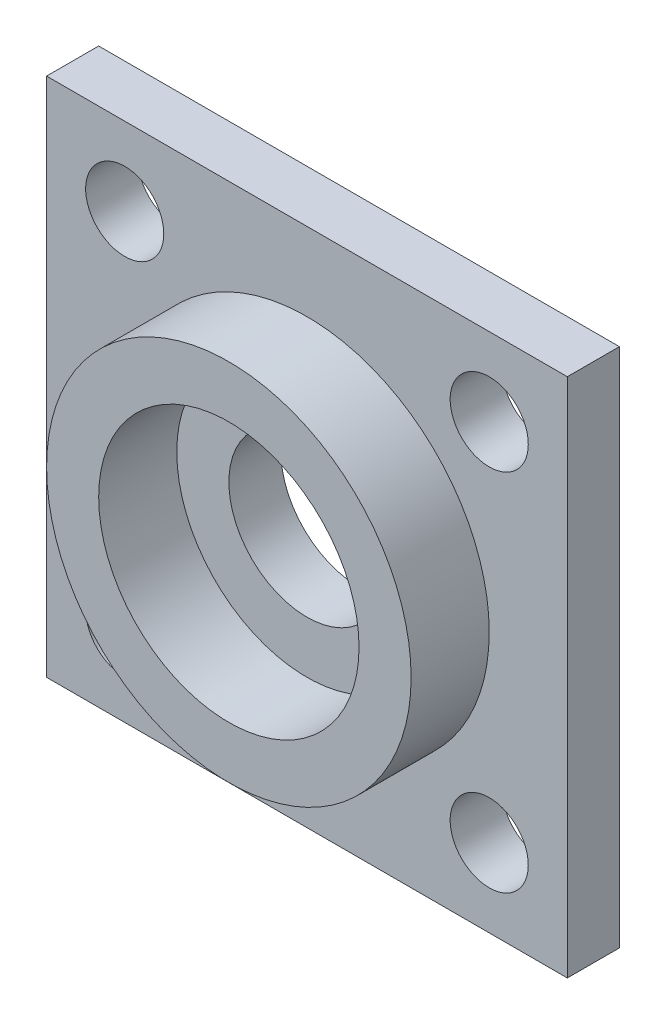
ISO-10303-21;
HEADER;
FILE_DESCRIPTION(('STEP AP214'),'2;1');
FILE_NAME('part.step','',(''),(''),'','','');
FILE_SCHEMA(('AUTOMOTIVE_DESIGN { 1 0 10303 214 1 1 1 1 }'));
ENDSEC;
DATA;
#1=APPLICATION_CONTEXT('core data for automotive mechanical design processes');
#2=APPLICATION_PROTOCOL_DEFINITION('international standard','automotive_design',2000,#1);
#3=PRODUCT_CONTEXT('',#1,'mechanical');
#4=PRODUCT('Part','Part','',(#3));
#5=PRODUCT_RELATED_PRODUCT_CATEGORY('part','',(#4));
#6=PRODUCT_DEFINITION_FORMATION('','',#4);
#7=PRODUCT_DEFINITION_CONTEXT('part definition',#1,'design');
#8=PRODUCT_DEFINITION('design','',#6,#7);
#9=PRODUCT_DEFINITION_SHAPE('','',#8);
#10=(LENGTH_UNIT() NAMED_UNIT(*) SI_UNIT(.MILLI.,.METRE.));
#11=(NAMED_UNIT(*) PLANE_ANGLE_UNIT() SI_UNIT($,.RADIAN.));
#12=(NAMED_UNIT(*) SI_UNIT($,.STERADIAN.) SOLID_ANGLE_UNIT());
#13=UNCERTAINTY_MEASURE_WITH_UNIT(LENGTH_MEASURE(1.E-05),#10,'distance_accuracy_value','');
#14=(GEOMETRIC_REPRESENTATION_CONTEXT(3) GLOBAL_UNCERTAINTY_ASSIGNED_CONTEXT((#13)) GLOBAL_UNIT_ASSIGNED_CONTEXT((#10,
#11,#12)) REPRESENTATION_CONTEXT('',''));
#15=CARTESIAN_POINT('',(0.,0.,0.));
#16=DIRECTION('',(0.,0.,1.));
#17=DIRECTION('',(1.,0.,0.));
#18=AXIS2_PLACEMENT_3D('',#15,#16,#17);
#19=CARTESIAN_POINT('',(0.,0.,2.));
#20=DIRECTION('',(0.,0.,1.));
#21=DIRECTION('',(1.,0.,0.));
#22=AXIS2_PLACEMENT_3D('',#19,#20,#21);
#23=PLANE('',#22);
#24=CARTESIAN_POINT('',(0.,0.,2.));
#25=DIRECTION('',(0.,0.,1.));
#26=DIRECTION('',(1.,0.,0.));
#27=AXIS2_PLACEMENT_3D('',#24,#25,#26);
#28=CIRCLE('',#27,3.);
#29=CARTESIAN_POINT('',(3.,0.,2.));
#30=VERTEX_POINT('',#29);
#31=EDGE_CURVE('E156',#30,#30,#28,.T.);
#32=ORIENTED_EDGE('',*,*,#31,.F.);
#33=EDGE_LOOP('',(#32));
#34=FACE_BOUND('',#33,.T.);
#35=CARTESIAN_POINT('',(0.,0.,2.));
#36=DIRECTION('',(0.,0.,1.));
#37=DIRECTION('',(1.,0.,0.));
#38=AXIS2_PLACEMENT_3D('',#35,#36,#37);
#39=CIRCLE('',#38,5.);
#40=CARTESIAN_POINT('',(5.,0.,2.));
#41=VERTEX_POINT('',#40);
#42=EDGE_CURVE('E11',#41,#41,#39,.F.);
#43=ORIENTED_EDGE('',*,*,#42,.F.);
#44=EDGE_LOOP('',(#43));
#45=FACE_BOUND('',#44,.T.);
#46=ADVANCED_FACE('F35',(#34,#45),#23,.T.);
#47=CARTESIAN_POINT('',(0.,0.,2.));
#48=DIRECTION('',(0.,0.,1.));
#49=DIRECTION('',(1.,0.,0.));
#50=AXIS2_PLACEMENT_3D('',#47,#48,#49);
#51=CIRCLE('',#50,7.);
#52=CARTESIAN_POINT('',(7.,0.,2.));
#53=VERTEX_POINT('',#52);
#54=EDGE_CURVE('E144',#53,#53,#51,.T.);
#55=ORIENTED_EDGE('',*,*,#54,.F.);
#56=EDGE_LOOP('',(#55));
#57=FACE_BOUND('',#56,.T.);
#58=CARTESIAN_POINT('',(7.00000000000039,-6.99999999999961,2.));
#59=DIRECTION('',(0.,0.,1.));
#60=DIRECTION('',(1.,0.,0.));
#61=AXIS2_PLACEMENT_3D('',#58,#59,#60);
#62=CIRCLE('',#61,1.50000000000055);
#63=CARTESIAN_POINT('',(8.50000000000094,-6.99999999999961,2.));
#64=VERTEX_POINT('',#63);
#65=EDGE_CURVE('E148',#64,#64,#62,.T.);
#66=ORIENTED_EDGE('',*,*,#65,.F.);
#67=EDGE_LOOP('',(#66));
#68=FACE_BOUND('',#67,.T.);
#69=DIRECTION('',(0.,1.,0.));
#70=VECTOR('',#69,1.);
#71=CARTESIAN_POINT('',(10.,10.,2.));
#72=LINE('',#71,#70);
#73=CARTESIAN_POINT('',(10.,-10.,2.));
#74=VERTEX_POINT('',#73);
#75=CARTESIAN_POINT('',(10.,10.,2.));
#76=VERTEX_POINT('',#75);
#77=EDGE_CURVE('E89',#74,#76,#72,.T.);
#78=ORIENTED_EDGE('',*,*,#77,.T.);
#79=DIRECTION('',(-1.,0.,0.));
#80=VECTOR('',#79,1.);
#81=CARTESIAN_POINT('',(-10.,10.,2.));
#82=LINE('',#81,#80);
#83=CARTESIAN_POINT('',(-10.,10.,2.));
#84=VERTEX_POINT('',#83);
#85=EDGE_CURVE('E83',#76,#84,#82,.T.);
#86=ORIENTED_EDGE('',*,*,#85,.T.);
#87=DIRECTION('',(0.,-1.,0.));
#88=VECTOR('',#87,1.);
#89=CARTESIAN_POINT('',(-10.,10.,2.));
#90=LINE('',#89,#88);
#91=CARTESIAN_POINT('',(-10.,-10.,2.));
#92=VERTEX_POINT('',#91);
#93=EDGE_CURVE('E87',#84,#92,#90,.T.);
#94=ORIENTED_EDGE('',*,*,#93,.T.);
#95=DIRECTION('',(1.,0.,0.));
#96=VECTOR('',#95,1.);
#97=CARTESIAN_POINT('',(-10.,-10.,2.));
#98=LINE('',#97,#96);
#99=EDGE_CURVE('E52',#92,#74,#98,.T.);
#100=ORIENTED_EDGE('',*,*,#99,.T.);
#101=EDGE_LOOP('',(#78,#86,#94,#100));
#102=FACE_BOUND('',#101,.T.);
#103=CARTESIAN_POINT('',(-7.,7.,2.));
#104=DIRECTION('',(0.,0.,1.));
#105=DIRECTION('',(1.,0.,0.));
#106=AXIS2_PLACEMENT_3D('',#103,#104,#105);
#107=CIRCLE('',#106,1.5);
#108=CARTESIAN_POINT('',(-5.5,7.,2.));
#109=VERTEX_POINT('',#108);
#110=EDGE_CURVE('E106',#109,#109,#107,.T.);
#111=ORIENTED_EDGE('',*,*,#110,.F.);
#112=EDGE_LOOP('',(#111));
#113=FACE_BOUND('',#112,.T.);
#114=CARTESIAN_POINT('',(7.,7.00000000000039,2.));
#115=DIRECTION('',(0.,0.,1.));
#116=DIRECTION('',(1.,0.,0.));
#117=AXIS2_PLACEMENT_3D('',#114,#115,#116);
#118=CIRCLE('',#117,1.5000000000004);
#119=CARTESIAN_POINT('',(8.5000000000004,7.00000000000039,2.));
#120=VERTEX_POINT('',#119);
#121=EDGE_CURVE('E152',#120,#120,#118,.T.);
#122=ORIENTED_EDGE('',*,*,#121,.F.);
#123=EDGE_LOOP('',(#122));
#124=FACE_BOUND('',#123,.T.);
#125=CARTESIAN_POINT('',(-6.99999999999961,-7.,2.));
#126=DIRECTION('',(0.,0.,1.));
#127=DIRECTION('',(1.,0.,0.));
#128=AXIS2_PLACEMENT_3D('',#125,#126,#127);
#129=CIRCLE('',#128,1.50000000000021);
#130=CARTESIAN_POINT('',(-5.4999999999994,-7.,2.));
#131=VERTEX_POINT('',#130);
#132=EDGE_CURVE('E138',#131,#131,#129,.T.);
#133=ORIENTED_EDGE('',*,*,#132,.F.);
#134=EDGE_LOOP('',(#133));
#135=FACE_BOUND('',#134,.T.);
#136=ADVANCED_FACE('F84',(#57,#68,#102,#113,#124,#135),#23,.T.);
#137=CARTESIAN_POINT('',(0.,0.,0.));
#138=DIRECTION('',(0.,0.,1.));
#139=DIRECTION('',(1.,0.,0.));
#140=AXIS2_PLACEMENT_3D('',#137,#138,#139);
#141=PLANE('',#140);
#142=DIRECTION('',(0.,1.,0.));
#143=VECTOR('',#142,1.);
#144=CARTESIAN_POINT('',(10.,10.,0.));
#145=LINE('',#144,#143);
#146=CARTESIAN_POINT('',(10.,-10.,0.));
#147=VERTEX_POINT('',#146);
#148=CARTESIAN_POINT('',(10.,10.,0.));
#149=VERTEX_POINT('',#148);
#150=EDGE_CURVE('E103',#147,#149,#145,.T.);
#151=ORIENTED_EDGE('',*,*,#150,.F.);
#152=DIRECTION('',(1.,0.,0.));
#153=VECTOR('',#152,1.);
#154=CARTESIAN_POINT('',(-10.,-10.,0.));
#155=LINE('',#154,#153);
#156=CARTESIAN_POINT('',(-10.,-10.,0.));
#157=VERTEX_POINT('',#156);
#158=EDGE_CURVE('E75',#157,#147,#155,.T.);
#159=ORIENTED_EDGE('',*,*,#158,.F.);
#160=DIRECTION('',(0.,-1.,0.));
#161=VECTOR('',#160,1.);
#162=CARTESIAN_POINT('',(-10.,10.,0.));
#163=LINE('',#162,#161);
#164=CARTESIAN_POINT('',(-10.,10.,0.));
#165=VERTEX_POINT('',#164);
#166=EDGE_CURVE('E69',#165,#157,#163,.T.);
#167=ORIENTED_EDGE('',*,*,#166,.F.);
#168=DIRECTION('',(-1.,0.,0.));
#169=VECTOR('',#168,1.);
#170=CARTESIAN_POINT('',(-10.,10.,0.));
#171=LINE('',#170,#169);
#172=EDGE_CURVE('E94',#149,#165,#171,.T.);
#173=ORIENTED_EDGE('',*,*,#172,.F.);
#174=EDGE_LOOP('',(#151,#159,#167,#173));
#175=FACE_BOUND('',#174,.T.);
#176=CARTESIAN_POINT('',(-7.,7.,0.));
#177=DIRECTION('',(0.,0.,1.));
#178=DIRECTION('',(1.,0.,0.));
#179=AXIS2_PLACEMENT_3D('',#176,#177,#178);
#180=CIRCLE('',#179,1.5);
#181=CARTESIAN_POINT('',(-5.5,7.,0.));
#182=VERTEX_POINT('',#181);
#183=EDGE_CURVE('E121',#182,#182,#180,.T.);
#184=ORIENTED_EDGE('',*,*,#183,.T.);
#185=EDGE_LOOP('',(#184));
#186=FACE_BOUND('',#185,.T.);
#187=CARTESIAN_POINT('',(0.,0.,0.));
#188=DIRECTION('',(0.,0.,1.));
#189=DIRECTION('',(1.,0.,0.));
#190=AXIS2_PLACEMENT_3D('',#187,#188,#189);
#191=CIRCLE('',#190,3.);
#192=CARTESIAN_POINT('',(3.,0.,0.));
#193=VERTEX_POINT('',#192);
#194=EDGE_CURVE('E125',#193,#193,#191,.T.);
#195=ORIENTED_EDGE('',*,*,#194,.T.);
#196=EDGE_LOOP('',(#195));
#197=FACE_BOUND('',#196,.T.);
#198=CARTESIAN_POINT('',(7.,7.00000000000039,0.));
#199=DIRECTION('',(0.,0.,1.));
#200=DIRECTION('',(1.,0.,0.));
#201=AXIS2_PLACEMENT_3D('',#198,#199,#200);
#202=CIRCLE('',#201,1.5000000000004);
#203=CARTESIAN_POINT('',(8.5000000000004,7.00000000000039,0.));
#204=VERTEX_POINT('',#203);
#205=EDGE_CURVE('E129',#204,#204,#202,.T.);
#206=ORIENTED_EDGE('',*,*,#205,.T.);
#207=EDGE_LOOP('',(#206));
#208=FACE_BOUND('',#207,.T.);
#209=CARTESIAN_POINT('',(7.00000000000039,-6.99999999999961,0.));
#210=DIRECTION('',(0.,0.,1.));
#211=DIRECTION('',(1.,0.,0.));
#212=AXIS2_PLACEMENT_3D('',#209,#210,#211);
#213=CIRCLE('',#212,1.50000000000055);
#214=CARTESIAN_POINT('',(8.50000000000094,-6.99999999999961,0.));
#215=VERTEX_POINT('',#214);
#216=EDGE_CURVE('E133',#215,#215,#213,.T.);
#217=ORIENTED_EDGE('',*,*,#216,.T.);
#218=EDGE_LOOP('',(#217));
#219=FACE_BOUND('',#218,.T.);
#220=CARTESIAN_POINT('',(-6.99999999999961,-7.,0.));
#221=DIRECTION('',(0.,0.,1.));
#222=DIRECTION('',(1.,0.,0.));
#223=AXIS2_PLACEMENT_3D('',#220,#221,#222);
#224=CIRCLE('',#223,1.50000000000021);
#225=CARTESIAN_POINT('',(-5.4999999999994,-7.,0.));
#226=VERTEX_POINT('',#225);
#227=EDGE_CURVE('E136',#226,#226,#224,.T.);
#228=ORIENTED_EDGE('',*,*,#227,.T.);
#229=EDGE_LOOP('',(#228));
#230=FACE_BOUND('',#229,.T.);
#231=ADVANCED_FACE('F114',(#175,#186,#197,#208,#219,#230),#141,.F.);
#232=CARTESIAN_POINT('',(10.,10.,2.));
#233=DIRECTION('',(-1.,0.,0.));
#234=DIRECTION('',(0.,-1.,0.));
#235=AXIS2_PLACEMENT_3D('',#232,#233,#234);
#236=PLANE('',#235);
#237=ORIENTED_EDGE('',*,*,#150,.T.);
#238=DIRECTION('',(0.,0.,-1.));
#239=VECTOR('',#238,1.);
#240=CARTESIAN_POINT('',(10.,10.,2.));
#241=LINE('',#240,#239);
#242=EDGE_CURVE('E44',#76,#149,#241,.T.);
#243=ORIENTED_EDGE('',*,*,#242,.F.);
#244=ORIENTED_EDGE('',*,*,#77,.F.);
#245=DIRECTION('',(0.,0.,-1.));
#246=VECTOR('',#245,1.);
#247=CARTESIAN_POINT('',(10.,-10.,2.));
#248=LINE('',#247,#246);
#249=EDGE_CURVE('E99',#74,#147,#248,.T.);
#250=ORIENTED_EDGE('',*,*,#249,.T.);
#251=EDGE_LOOP('',(#237,#243,#244,#250));
#252=FACE_BOUND('',#251,.T.);
#253=ADVANCED_FACE('F37',(#252),#236,.F.);
#254=CARTESIAN_POINT('',(-10.,10.,2.));
#255=DIRECTION('',(0.,-1.,0.));
#256=DIRECTION('',(0.,0.,-1.));
#257=AXIS2_PLACEMENT_3D('',#254,#255,#256);
#258=PLANE('',#257);
#259=ORIENTED_EDGE('',*,*,#172,.T.);
#260=DIRECTION('',(0.,0.,-1.));
#261=VECTOR('',#260,1.);
#262=CARTESIAN_POINT('',(-10.,10.,2.));
#263=LINE('',#262,#261);
#264=EDGE_CURVE('E92',#84,#165,#263,.T.);
#265=ORIENTED_EDGE('',*,*,#264,.F.);
#266=ORIENTED_EDGE('',*,*,#85,.F.);
#267=ORIENTED_EDGE('',*,*,#242,.T.);
#268=EDGE_LOOP('',(#259,#265,#266,#267));
#269=FACE_BOUND('',#268,.T.);
#270=ADVANCED_FACE('F93',(#269),#258,.F.);
#271=CARTESIAN_POINT('',(-10.,10.,2.));
#272=DIRECTION('',(1.,0.,0.));
#273=DIRECTION('',(0.,1.,0.));
#274=AXIS2_PLACEMENT_3D('',#271,#272,#273);
#275=PLANE('',#274);
#276=ORIENTED_EDGE('',*,*,#166,.T.);
#277=DIRECTION('',(0.,0.,-1.));
#278=VECTOR('',#277,1.);
#279=CARTESIAN_POINT('',(-10.,-10.,2.));
#280=LINE('',#279,#278);
#281=EDGE_CURVE('E95',#92,#157,#280,.T.);
#282=ORIENTED_EDGE('',*,*,#281,.F.);
#283=ORIENTED_EDGE('',*,*,#93,.F.);
#284=ORIENTED_EDGE('',*,*,#264,.T.);
#285=EDGE_LOOP('',(#276,#282,#283,#284));
#286=FACE_BOUND('',#285,.T.);
#287=ADVANCED_FACE('F97',(#286),#275,.F.);
#288=CARTESIAN_POINT('',(-10.,-10.,2.));
#289=DIRECTION('',(0.,1.,0.));
#290=DIRECTION('',(0.,0.,1.));
#291=AXIS2_PLACEMENT_3D('',#288,#289,#290);
#292=PLANE('',#291);
#293=ORIENTED_EDGE('',*,*,#158,.T.);
#294=ORIENTED_EDGE('',*,*,#249,.F.);
#295=ORIENTED_EDGE('',*,*,#99,.F.);
#296=ORIENTED_EDGE('',*,*,#281,.T.);
#297=EDGE_LOOP('',(#293,#294,#295,#296));
#298=FACE_BOUND('',#297,.T.);
#299=ADVANCED_FACE('F199',(#298),#292,.F.);
#300=CARTESIAN_POINT('',(-7.,7.,2.));
#301=DIRECTION('',(0.,0.,-1.));
#302=DIRECTION('',(-1.,0.,0.));
#303=AXIS2_PLACEMENT_3D('',#300,#301,#302);
#304=CYLINDRICAL_SURFACE('',#303,1.5);
#305=ORIENTED_EDGE('',*,*,#110,.T.);
#306=EDGE_LOOP('',(#305));
#307=FACE_BOUND('',#306,.T.);
#308=ORIENTED_EDGE('',*,*,#183,.F.);
#309=EDGE_LOOP('',(#308));
#310=FACE_BOUND('',#309,.T.);
#311=ADVANCED_FACE('F164',(#307,#310),#304,.F.);
#312=CARTESIAN_POINT('',(0.,0.,2.));
#313=DIRECTION('',(0.,0.,-1.));
#314=DIRECTION('',(-1.,0.,0.));
#315=AXIS2_PLACEMENT_3D('',#312,#313,#314);
#316=CYLINDRICAL_SURFACE('',#315,3.);
#317=ORIENTED_EDGE('',*,*,#31,.T.);
#318=EDGE_LOOP('',(#317));
#319=FACE_BOUND('',#318,.T.);
#320=ORIENTED_EDGE('',*,*,#194,.F.);
#321=EDGE_LOOP('',(#320));
#322=FACE_BOUND('',#321,.T.);
#323=ADVANCED_FACE('F278',(#319,#322),#316,.F.);
#324=CARTESIAN_POINT('',(7.,7.00000000000039,2.));
#325=DIRECTION('',(0.,0.,-1.));
#326=DIRECTION('',(-1.,0.,0.));
#327=AXIS2_PLACEMENT_3D('',#324,#325,#326);
#328=CYLINDRICAL_SURFACE('',#327,1.5000000000004);
#329=ORIENTED_EDGE('',*,*,#121,.T.);
#330=EDGE_LOOP('',(#329));
#331=FACE_BOUND('',#330,.T.);
#332=ORIENTED_EDGE('',*,*,#205,.F.);
#333=EDGE_LOOP('',(#332));
#334=FACE_BOUND('',#333,.T.);
#335=ADVANCED_FACE('F186',(#331,#334),#328,.F.);
#336=CARTESIAN_POINT('',(7.00000000000039,-6.99999999999961,2.));
#337=DIRECTION('',(0.,0.,-1.));
#338=DIRECTION('',(-1.,0.,0.));
#339=AXIS2_PLACEMENT_3D('',#336,#337,#338);
#340=CYLINDRICAL_SURFACE('',#339,1.50000000000055);
#341=ORIENTED_EDGE('',*,*,#65,.T.);
#342=EDGE_LOOP('',(#341));
#343=FACE_BOUND('',#342,.T.);
#344=ORIENTED_EDGE('',*,*,#216,.F.);
#345=EDGE_LOOP('',(#344));
#346=FACE_BOUND('',#345,.T.);
#347=ADVANCED_FACE('F177',(#343,#346),#340,.F.);
#348=CARTESIAN_POINT('',(-6.99999999999961,-7.,2.));
#349=DIRECTION('',(0.,0.,-1.));
#350=DIRECTION('',(-1.,0.,0.));
#351=AXIS2_PLACEMENT_3D('',#348,#349,#350);
#352=CYLINDRICAL_SURFACE('',#351,1.50000000000021);
#353=ORIENTED_EDGE('',*,*,#132,.T.);
#354=EDGE_LOOP('',(#353));
#355=FACE_BOUND('',#354,.T.);
#356=ORIENTED_EDGE('',*,*,#227,.F.);
#357=EDGE_LOOP('',(#356));
#358=FACE_BOUND('',#357,.T.);
#359=ADVANCED_FACE('F174',(#355,#358),#352,.F.);
#360=CARTESIAN_POINT('',(0.,0.,5.));
#361=DIRECTION('',(0.,0.,1.));
#362=DIRECTION('',(1.,0.,0.));
#363=AXIS2_PLACEMENT_3D('',#360,#361,#362);
#364=PLANE('',#363);
#365=CARTESIAN_POINT('',(0.,0.,5.));
#366=DIRECTION('',(0.,0.,1.));
#367=DIRECTION('',(1.,0.,0.));
#368=AXIS2_PLACEMENT_3D('',#365,#366,#367);
#369=CIRCLE('',#368,7.);
#370=CARTESIAN_POINT('',(7.,0.,5.));
#371=VERTEX_POINT('',#370);
#372=EDGE_CURVE('E139',#371,#371,#369,.T.);
#373=ORIENTED_EDGE('',*,*,#372,.T.);
#374=EDGE_LOOP('',(#373));
#375=FACE_BOUND('',#374,.T.);
#376=CARTESIAN_POINT('',(0.,0.,5.));
#377=DIRECTION('',(0.,0.,1.));
#378=DIRECTION('',(1.,0.,0.));
#379=AXIS2_PLACEMENT_3D('',#376,#377,#378);
#380=CIRCLE('',#379,5.);
#381=CARTESIAN_POINT('',(5.,0.,5.));
#382=VERTEX_POINT('',#381);
#383=EDGE_CURVE('E250',#382,#382,#380,.T.);
#384=ORIENTED_EDGE('',*,*,#383,.F.);
#385=EDGE_LOOP('',(#384));
#386=FACE_BOUND('',#385,.T.);
#387=ADVANCED_FACE('F176',(#375,#386),#364,.T.);
#388=CARTESIAN_POINT('',(0.,0.,5.));
#389=DIRECTION('',(0.,0.,-1.));
#390=DIRECTION('',(-1.,0.,0.));
#391=AXIS2_PLACEMENT_3D('',#388,#389,#390);
#392=CYLINDRICAL_SURFACE('',#391,7.);
#393=ORIENTED_EDGE('',*,*,#372,.F.);
#394=EDGE_LOOP('',(#393));
#395=FACE_BOUND('',#394,.T.);
#396=ORIENTED_EDGE('',*,*,#54,.T.);
#397=EDGE_LOOP('',(#396));
#398=FACE_BOUND('',#397,.T.);
#399=ADVANCED_FACE('F183',(#395,#398),#392,.T.);
#400=CARTESIAN_POINT('',(0.,0.,5.));
#401=DIRECTION('',(0.,0.,-1.));
#402=DIRECTION('',(-1.,0.,0.));
#403=AXIS2_PLACEMENT_3D('',#400,#401,#402);
#404=CYLINDRICAL_SURFACE('',#403,5.);
#405=ORIENTED_EDGE('',*,*,#383,.T.);
#406=EDGE_LOOP('',(#405));
#407=FACE_BOUND('',#406,.T.);
#408=ORIENTED_EDGE('',*,*,#42,.T.);
#409=EDGE_LOOP('',(#408));
#410=FACE_BOUND('',#409,.T.);
#411=ADVANCED_FACE('F234',(#407,#410),#404,.F.);
#412=CLOSED_SHELL('',(#46,#136,#231,#253,#270,#287,#299,#311,#323,#335,#347,#359,#387,#399,#411));
#413=MANIFOLD_SOLID_BREP('B2',#412);
#414=ADVANCED_BREP_SHAPE_REPRESENTATION('',(#18,#413),#14);
#415=SHAPE_DEFINITION_REPRESENTATION(#9,#414);
ENDSEC;
END-ISO-10303-21;
